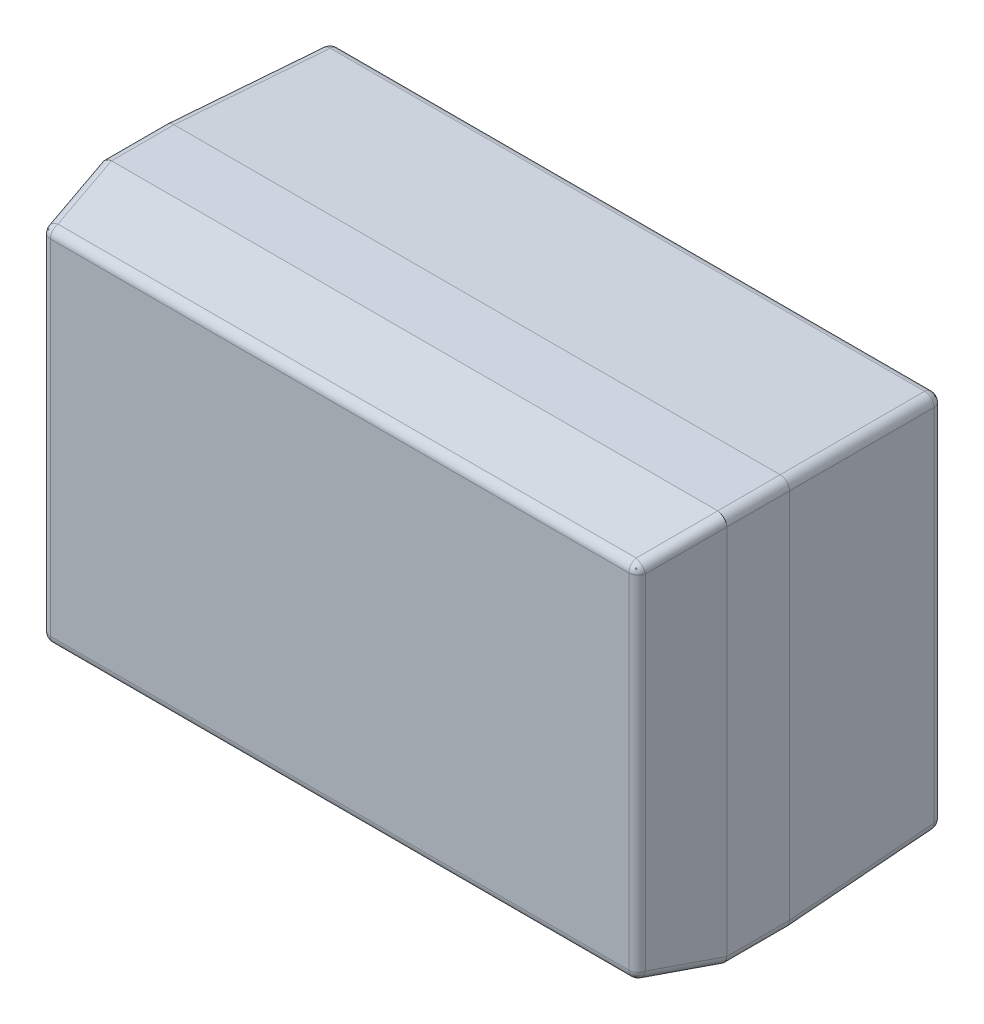
ISO-10303-21;
HEADER;
FILE_DESCRIPTION(('STEP AP214'),'2;1');
FILE_NAME('part.step','',(''),(''),'','','');
FILE_SCHEMA(('AUTOMOTIVE_DESIGN { 1 0 10303 214 1 1 1 1 }'));
ENDSEC;
DATA;
#1=APPLICATION_CONTEXT('core data for automotive mechanical design processes');
#2=APPLICATION_PROTOCOL_DEFINITION('international standard','automotive_design',2000,#1);
#3=PRODUCT_CONTEXT('',#1,'mechanical');
#4=PRODUCT('Part','Part','',(#3));
#5=PRODUCT_RELATED_PRODUCT_CATEGORY('part','',(#4));
#6=PRODUCT_DEFINITION_FORMATION('','',#4);
#7=PRODUCT_DEFINITION_CONTEXT('part definition',#1,'design');
#8=PRODUCT_DEFINITION('design','',#6,#7);
#9=PRODUCT_DEFINITION_SHAPE('','',#8);
#10=(LENGTH_UNIT() NAMED_UNIT(*) SI_UNIT(.MILLI.,.METRE.));
#11=(NAMED_UNIT(*) PLANE_ANGLE_UNIT() SI_UNIT($,.RADIAN.));
#12=(NAMED_UNIT(*) SI_UNIT($,.STERADIAN.) SOLID_ANGLE_UNIT());
#13=UNCERTAINTY_MEASURE_WITH_UNIT(LENGTH_MEASURE(1.E-05),#10,'distance_accuracy_value','');
#14=(GEOMETRIC_REPRESENTATION_CONTEXT(3) GLOBAL_UNCERTAINTY_ASSIGNED_CONTEXT((#13)) GLOBAL_UNIT_ASSIGNED_CONTEXT((#10,
#11,#12)) REPRESENTATION_CONTEXT('',''));
#15=CARTESIAN_POINT('',(0.,0.,0.));
#16=DIRECTION('',(0.,0.,1.));
#17=DIRECTION('',(1.,0.,0.));
#18=AXIS2_PLACEMENT_3D('',#15,#16,#17);
#19=CARTESIAN_POINT('',(-0.92560587332,-0.55060587332,0.92));
#20=DIRECTION('',(-0.495788828813145,-0.495788828812795,0.713012534566208));
#21=DIRECTION('',(-0.821023882220121,-2.57793786317961E-13,-0.570893847246755));
#22=AXIS2_PLACEMENT_3D('',#19,#20,#21);
#23=SPHERICAL_SURFACE('',#22,0.03);
#24=CARTESIAN_POINT('',(-0.940479538184394,-0.565479538184384,0.941390376036986));
#25=VERTEX_POINT('',#24);
#26=VERTEX_LOOP('',#25);
#27=FACE_BOUND('',#26,.T.);
#28=CARTESIAN_POINT('',(-0.925605873319475,-0.550605873319475,0.91999999999946));
#29=DIRECTION('',(0.199840191744013,0.199840191744013,0.959232920373062));
#30=DIRECTION('',(0.978980419737681,0.,-0.203954254111634));
#31=AXIS2_PLACEMENT_3D('',#28,#29,#30);
#32=CIRCLE('',#31,0.03);
#33=CARTESIAN_POINT('',(-0.92560587332,-0.579975285912041,0.926118627623009));
#34=VERTEX_POINT('',#33);
#35=CARTESIAN_POINT('',(-0.954975285911737,-0.55060587332,0.926118627622945));
#36=VERTEX_POINT('',#35);
#37=EDGE_CURVE('E132',#34,#36,#32,.F.);
#38=ORIENTED_EDGE('',*,*,#37,.F.);
#39=CARTESIAN_POINT('',(-0.92560587332,-0.55060587332,0.92));
#40=DIRECTION('',(-1.,0.,0.));
#41=DIRECTION('',(0.,-1.,0.));
#42=AXIS2_PLACEMENT_3D('',#39,#40,#41);
#43=CIRCLE('',#42,0.03);
#44=CARTESIAN_POINT('',(-0.92560587332,-0.55060587332,0.95));
#45=VERTEX_POINT('',#44);
#46=EDGE_CURVE('E134',#45,#34,#43,.F.);
#47=ORIENTED_EDGE('',*,*,#46,.F.);
#48=CARTESIAN_POINT('',(-0.92560587332,-0.55060587332,0.92));
#49=DIRECTION('',(0.,1.,0.));
#50=DIRECTION('',(-1.,0.,0.));
#51=AXIS2_PLACEMENT_3D('',#48,#49,#50);
#52=CIRCLE('',#51,0.03);
#53=EDGE_CURVE('E136',#36,#45,#52,.T.);
#54=ORIENTED_EDGE('',*,*,#53,.F.);
#55=EDGE_LOOP('',(#38,#47,#54));
#56=FACE_BOUND('',#55,.T.);
#57=ADVANCED_FACE('F17',(#27,#56),#23,.T.);
#58=CARTESIAN_POINT('',(0.92560587332,-0.55060587332,0.92));
#59=DIRECTION('',(0.495788828813145,-0.495788828812795,0.713012534566208));
#60=DIRECTION('',(-0.821023882220121,2.57793786317961E-13,0.570893847246755));
#61=AXIS2_PLACEMENT_3D('',#58,#59,#60);
#62=SPHERICAL_SURFACE('',#61,0.03);
#63=CARTESIAN_POINT('',(0.940479538184394,-0.565479538184384,0.941390376036986));
#64=VERTEX_POINT('',#63);
#65=VERTEX_LOOP('',#64);
#66=FACE_BOUND('',#65,.T.);
#67=CARTESIAN_POINT('',(0.92560587332,-0.55060587332,0.92));
#68=DIRECTION('',(-1.,0.,0.));
#69=DIRECTION('',(0.,-1.,0.));
#70=AXIS2_PLACEMENT_3D('',#67,#68,#69);
#71=CIRCLE('',#70,0.03);
#72=CARTESIAN_POINT('',(0.92560587332,-0.579975285911975,0.926118627622995));
#73=VERTEX_POINT('',#72);
#74=CARTESIAN_POINT('',(0.92560587332,-0.55060587332,0.95));
#75=VERTEX_POINT('',#74);
#76=EDGE_CURVE('E231',#73,#75,#71,.T.);
#77=ORIENTED_EDGE('',*,*,#76,.F.);
#78=CARTESIAN_POINT('',(0.925605873319808,-0.550605873319808,0.919999999999598));
#79=DIRECTION('',(0.199840191744013,-0.199840191744013,-0.959232920373062));
#80=DIRECTION('',(-0.978980419737681,0.,-0.203954254111634));
#81=AXIS2_PLACEMENT_3D('',#78,#79,#80);
#82=CIRCLE('',#81,0.03);
#83=CARTESIAN_POINT('',(0.954975285912041,-0.55060587332,0.926118627623009));
#84=VERTEX_POINT('',#83);
#85=EDGE_CURVE('E226',#84,#73,#82,.T.);
#86=ORIENTED_EDGE('',*,*,#85,.F.);
#87=CARTESIAN_POINT('',(0.92560587332,-0.55060587332,0.92));
#88=DIRECTION('',(0.,-1.,0.));
#89=DIRECTION('',(0.,0.,-1.));
#90=AXIS2_PLACEMENT_3D('',#87,#88,#89);
#91=CIRCLE('',#90,0.03);
#92=EDGE_CURVE('E141',#75,#84,#91,.F.);
#93=ORIENTED_EDGE('',*,*,#92,.F.);
#94=EDGE_LOOP('',(#77,#86,#93));
#95=FACE_BOUND('',#94,.T.);
#96=ADVANCED_FACE('F128',(#66,#95),#62,.T.);
#97=CARTESIAN_POINT('',(-0.92560587332,0.55060587332,0.92));
#98=DIRECTION('',(-0.495788828813145,0.495788828812795,0.713012534566208));
#99=DIRECTION('',(-0.821023882220121,2.57793786317961E-13,-0.570893847246755));
#100=AXIS2_PLACEMENT_3D('',#97,#98,#99);
#101=SPHERICAL_SURFACE('',#100,0.03);
#102=CARTESIAN_POINT('',(-0.940479538184394,0.565479538184384,0.941390376036986));
#103=VERTEX_POINT('',#102);
#104=VERTEX_LOOP('',#103);
#105=FACE_BOUND('',#104,.T.);
#106=CARTESIAN_POINT('',(-0.925605873319808,0.550605873319808,0.919999999999598));
#107=DIRECTION('',(0.199840191744013,-0.199840191744013,0.959232920373062));
#108=DIRECTION('',(0.978980419737681,0.,-0.203954254111634));
#109=AXIS2_PLACEMENT_3D('',#106,#107,#108);
#110=CIRCLE('',#109,0.03);
#111=CARTESIAN_POINT('',(-0.954975285912041,0.55060587332,0.926118627623009));
#112=VERTEX_POINT('',#111);
#113=CARTESIAN_POINT('',(-0.92560587332,0.579975285911975,0.926118627622995));
#114=VERTEX_POINT('',#113);
#115=EDGE_CURVE('E338',#112,#114,#110,.F.);
#116=ORIENTED_EDGE('',*,*,#115,.F.);
#117=CARTESIAN_POINT('',(-0.92560587332,0.55060587332,0.92));
#118=DIRECTION('',(0.,1.,0.));
#119=DIRECTION('',(-1.,0.,0.));
#120=AXIS2_PLACEMENT_3D('',#117,#118,#119);
#121=CIRCLE('',#120,0.03);
#122=CARTESIAN_POINT('',(-0.92560587332,0.55060587332,0.95));
#123=VERTEX_POINT('',#122);
#124=EDGE_CURVE('E21',#123,#112,#121,.F.);
#125=ORIENTED_EDGE('',*,*,#124,.F.);
#126=CARTESIAN_POINT('',(-0.92560587332,0.55060587332,0.92));
#127=DIRECTION('',(1.,0.,0.));
#128=DIRECTION('',(0.,0.,-1.));
#129=AXIS2_PLACEMENT_3D('',#126,#127,#128);
#130=CIRCLE('',#129,0.03);
#131=EDGE_CURVE('E333',#114,#123,#130,.T.);
#132=ORIENTED_EDGE('',*,*,#131,.F.);
#133=EDGE_LOOP('',(#116,#125,#132));
#134=FACE_BOUND('',#133,.T.);
#135=ADVANCED_FACE('F215',(#105,#134),#101,.T.);
#136=CARTESIAN_POINT('',(0.,0.,0.95));
#137=DIRECTION('',(0.,0.,1.));
#138=DIRECTION('',(1.,0.,0.));
#139=AXIS2_PLACEMENT_3D('',#136,#137,#138);
#140=PLANE('',#139);
#141=DIRECTION('',(0.,-1.,0.));
#142=VECTOR('',#141,1.);
#143=CARTESIAN_POINT('',(0.92560587332,-0.15625,0.95));
#144=LINE('',#143,#142);
#145=CARTESIAN_POINT('',(0.92560587332,0.55060587332,0.95));
#146=VERTEX_POINT('',#145);
#147=EDGE_CURVE('E224',#146,#75,#144,.T.);
#148=ORIENTED_EDGE('',*,*,#147,.F.);
#149=DIRECTION('',(1.,0.,0.));
#150=VECTOR('',#149,1.);
#151=CARTESIAN_POINT('',(0.25,0.55060587332,0.95));
#152=LINE('',#151,#150);
#153=EDGE_CURVE('E223',#123,#146,#152,.T.);
#154=ORIENTED_EDGE('',*,*,#153,.F.);
#155=DIRECTION('',(0.,1.,0.));
#156=VECTOR('',#155,1.);
#157=CARTESIAN_POINT('',(-0.92560587332,0.15625,0.95));
#158=LINE('',#157,#156);
#159=EDGE_CURVE('E110',#45,#123,#158,.T.);
#160=ORIENTED_EDGE('',*,*,#159,.F.);
#161=DIRECTION('',(-1.,0.,0.));
#162=VECTOR('',#161,1.);
#163=CARTESIAN_POINT('',(-0.25,-0.55060587332,0.95));
#164=LINE('',#163,#162);
#165=EDGE_CURVE('E142',#75,#45,#164,.T.);
#166=ORIENTED_EDGE('',*,*,#165,.F.);
#167=EDGE_LOOP('',(#148,#154,#160,#166));
#168=FACE_BOUND('',#167,.T.);
#169=ADVANCED_FACE('F211',(#168),#140,.T.);
#170=CARTESIAN_POINT('',(0.92560587332,0.55060587332,0.92));
#171=DIRECTION('',(0.495788828813145,0.495788828812795,0.713012534566208));
#172=DIRECTION('',(-0.821023882220121,-2.57793786317961E-13,0.570893847246755));
#173=AXIS2_PLACEMENT_3D('',#170,#171,#172);
#174=SPHERICAL_SURFACE('',#173,0.03);
#175=CARTESIAN_POINT('',(0.940479538184394,0.565479538184384,0.941390376036986));
#176=VERTEX_POINT('',#175);
#177=VERTEX_LOOP('',#176);
#178=FACE_BOUND('',#177,.T.);
#179=CARTESIAN_POINT('',(0.925605873319475,0.550605873319475,0.91999999999946));
#180=DIRECTION('',(-0.199840191744013,-0.199840191744013,0.959232920373062));
#181=DIRECTION('',(0.978980419737681,0.,0.203954254111634));
#182=AXIS2_PLACEMENT_3D('',#179,#180,#181);
#183=CIRCLE('',#182,0.03);
#184=CARTESIAN_POINT('',(0.92560587332,0.579975285912041,0.926118627623009));
#185=VERTEX_POINT('',#184);
#186=CARTESIAN_POINT('',(0.954975285911747,0.550605873319738,0.926118627622893));
#187=VERTEX_POINT('',#186);
#188=EDGE_CURVE('E180',#185,#187,#183,.F.);
#189=ORIENTED_EDGE('',*,*,#188,.F.);
#190=CARTESIAN_POINT('',(0.92560587332,0.55060587332,0.92));
#191=DIRECTION('',(1.,0.,0.));
#192=DIRECTION('',(0.,0.,-1.));
#193=AXIS2_PLACEMENT_3D('',#190,#191,#192);
#194=CIRCLE('',#193,0.03);
#195=EDGE_CURVE('E336',#146,#185,#194,.F.);
#196=ORIENTED_EDGE('',*,*,#195,.F.);
#197=CARTESIAN_POINT('',(0.92560587332,0.55060587332,0.92));
#198=DIRECTION('',(0.,-1.,0.));
#199=DIRECTION('',(0.,0.,-1.));
#200=AXIS2_PLACEMENT_3D('',#197,#198,#199);
#201=CIRCLE('',#200,0.03);
#202=EDGE_CURVE('E227',#187,#146,#201,.T.);
#203=ORIENTED_EDGE('',*,*,#202,.F.);
#204=EDGE_LOOP('',(#189,#196,#203));
#205=FACE_BOUND('',#204,.T.);
#206=ADVANCED_FACE('F206',(#178,#205),#174,.T.);
#207=CARTESIAN_POINT('',(-0.92560587332,0.15625,0.92));
#208=DIRECTION('',(0.,1.,0.));
#209=DIRECTION('',(-1.,0.,0.));
#210=AXIS2_PLACEMENT_3D('',#207,#208,#209);
#211=CYLINDRICAL_SURFACE('',#210,0.03);
#212=ORIENTED_EDGE('',*,*,#53,.T.);
#213=ORIENTED_EDGE('',*,*,#159,.T.);
#214=ORIENTED_EDGE('',*,*,#124,.T.);
#215=DIRECTION('',(0.,1.,0.));
#216=VECTOR('',#215,1.);
#217=CARTESIAN_POINT('',(-0.954975285911888,0.3125,0.926118627622977));
#218=LINE('',#217,#216);
#219=EDGE_CURVE('E175',#36,#112,#218,.T.);
#220=ORIENTED_EDGE('',*,*,#219,.F.);
#221=EDGE_LOOP('',(#212,#213,#214,#220));
#222=FACE_BOUND('',#221,.T.);
#223=ADVANCED_FACE('F210',(#222),#211,.T.);
#224=CARTESIAN_POINT('',(-0.25,-0.55060587332,0.92));
#225=DIRECTION('',(-1.,0.,0.));
#226=DIRECTION('',(0.,-1.,0.));
#227=AXIS2_PLACEMENT_3D('',#224,#225,#226);
#228=CYLINDRICAL_SURFACE('',#227,0.03);
#229=ORIENTED_EDGE('',*,*,#76,.T.);
#230=ORIENTED_EDGE('',*,*,#165,.T.);
#231=ORIENTED_EDGE('',*,*,#46,.T.);
#232=DIRECTION('',(1.,0.,0.));
#233=VECTOR('',#232,1.);
#234=CARTESIAN_POINT('',(-0.5,-0.579975285911888,0.926118627622977));
#235=LINE('',#234,#233);
#236=EDGE_CURVE('E156',#73,#34,#235,.F.);
#237=ORIENTED_EDGE('',*,*,#236,.F.);
#238=EDGE_LOOP('',(#229,#230,#231,#237));
#239=FACE_BOUND('',#238,.T.);
#240=ADVANCED_FACE('F546',(#239),#228,.T.);
#241=CARTESIAN_POINT('',(-0.919097816345,-0.544097816345,0.951238673477));
#242=DIRECTION('',(0.199840191744013,0.199840191744013,0.959232920373062));
#243=DIRECTION('',(0.978980419737681,0.,-0.203954254111634));
#244=AXIS2_PLACEMENT_3D('',#241,#242,#243);
#245=CYLINDRICAL_SURFACE('',#244,0.03);
#246=DIRECTION('',(0.199840191744258,0.199840191744869,0.959232920372832));
#247=VECTOR('',#246,1.);
#248=CARTESIAN_POINT('',(-0.99999350771875,-0.595624095127,0.710031162949948));
#249=LINE('',#248,#247);
#250=CARTESIAN_POINT('',(-0.999996753859308,-0.595312047563499,0.71001558147497));
#251=VERTEX_POINT('',#250);
#252=EDGE_CURVE('E178',#251,#36,#249,.T.);
#253=ORIENTED_EDGE('',*,*,#252,.F.);
#254=CARTESIAN_POINT('',(-0.97,-0.595,0.706908191932541));
#255=DIRECTION('',(0.100954296128172,0.100954296128172,0.989755757844596));
#256=DIRECTION('',(-0.699863008090344,-0.699863008090344,0.14277093476429));
#257=AXIS2_PLACEMENT_3D('',#254,#255,#256);
#258=ELLIPSE('',#257,0.0303105081857077,0.03);
#259=CARTESIAN_POINT('',(-0.970312047563499,-0.624996753859308,0.71001558147497));
#260=VERTEX_POINT('',#259);
#261=EDGE_CURVE('E150',#260,#251,#258,.F.);
#262=ORIENTED_EDGE('',*,*,#261,.F.);
#263=DIRECTION('',(-0.199840191744869,-0.199840191744258,-0.959232920372832));
#264=VECTOR('',#263,1.);
#265=CARTESIAN_POINT('',(-0.92560587332,-0.579975285911888,0.926118627622977));
#266=LINE('',#265,#264);
#267=EDGE_CURVE('E146',#34,#260,#266,.T.);
#268=ORIENTED_EDGE('',*,*,#267,.F.);
#269=ORIENTED_EDGE('',*,*,#37,.T.);
#270=EDGE_LOOP('',(#253,#262,#268,#269));
#271=FACE_BOUND('',#270,.T.);
#272=ADVANCED_FACE('F147',(#271),#245,.T.);
#273=CARTESIAN_POINT('',(0.92560587332,-0.15625,0.92));
#274=DIRECTION('',(0.,-1.,0.));
#275=DIRECTION('',(0.,0.,-1.));
#276=AXIS2_PLACEMENT_3D('',#273,#274,#275);
#277=CYLINDRICAL_SURFACE('',#276,0.03);
#278=ORIENTED_EDGE('',*,*,#202,.T.);
#279=ORIENTED_EDGE('',*,*,#147,.T.);
#280=ORIENTED_EDGE('',*,*,#92,.T.);
#281=DIRECTION('',(0.,1.,0.));
#282=VECTOR('',#281,1.);
#283=CARTESIAN_POINT('',(0.954975285911888,-0.3125,0.926118627622977));
#284=LINE('',#283,#282);
#285=EDGE_CURVE('E195',#187,#84,#284,.F.);
#286=ORIENTED_EDGE('',*,*,#285,.F.);
#287=EDGE_LOOP('',(#278,#279,#280,#286));
#288=FACE_BOUND('',#287,.T.);
#289=ADVANCED_FACE('F540',(#288),#277,.T.);
#290=CARTESIAN_POINT('',(0.911609797176,-0.536609797176,0.98718116549));
#291=DIRECTION('',(0.199840191744013,-0.199840191744013,-0.959232920373062));
#292=DIRECTION('',(-0.978980419737681,0.,-0.203954254111634));
#293=AXIS2_PLACEMENT_3D('',#290,#291,#292);
#294=CYLINDRICAL_SURFACE('',#293,0.03);
#295=DIRECTION('',(-0.199840191744869,0.199840191744258,0.959232920372832));
#296=VECTOR('',#295,1.);
#297=CARTESIAN_POINT('',(0.970624095127,-0.62499350771875,0.710031162949948));
#298=LINE('',#297,#296);
#299=CARTESIAN_POINT('',(0.970312047563499,-0.624996753859365,0.710015581474982));
#300=VERTEX_POINT('',#299);
#301=EDGE_CURVE('E160',#300,#73,#298,.T.);
#302=ORIENTED_EDGE('',*,*,#301,.F.);
#303=CARTESIAN_POINT('',(0.97,-0.595,0.706908191934274));
#304=DIRECTION('',(-0.100954296128172,0.100954296128172,0.989755757844596));
#305=DIRECTION('',(0.699863008090344,-0.699863008090344,0.14277093476429));
#306=AXIS2_PLACEMENT_3D('',#303,#304,#305);
#307=ELLIPSE('',#306,0.0303105081857077,0.03);
#308=CARTESIAN_POINT('',(0.999996753859365,-0.595312047563499,0.710015581474982));
#309=VERTEX_POINT('',#308);
#310=EDGE_CURVE('E319',#309,#300,#307,.F.);
#311=ORIENTED_EDGE('',*,*,#310,.F.);
#312=DIRECTION('',(0.199840191744258,-0.199840191744869,-0.959232920372832));
#313=VECTOR('',#312,1.);
#314=CARTESIAN_POINT('',(0.954975285911888,-0.55060587332,0.926118627622977));
#315=LINE('',#314,#313);
#316=EDGE_CURVE('E197',#84,#309,#315,.T.);
#317=ORIENTED_EDGE('',*,*,#316,.F.);
#318=ORIENTED_EDGE('',*,*,#85,.T.);
#319=EDGE_LOOP('',(#302,#311,#317,#318));
#320=FACE_BOUND('',#319,.T.);
#321=ADVANCED_FACE('F537',(#320),#294,.T.);
#322=CARTESIAN_POINT('',(-0.911609797176,0.536609797176,0.98718116549));
#323=DIRECTION('',(0.199840191744013,-0.199840191744013,0.959232920373062));
#324=DIRECTION('',(0.978980419737681,0.,-0.203954254111634));
#325=AXIS2_PLACEMENT_3D('',#322,#323,#324);
#326=CYLINDRICAL_SURFACE('',#325,0.03);
#327=DIRECTION('',(0.199840191744869,-0.199840191744258,0.959232920372832));
#328=VECTOR('',#327,1.);
#329=CARTESIAN_POINT('',(-0.970624095127,0.624993507718751,0.710031162949948));
#330=LINE('',#329,#328);
#331=CARTESIAN_POINT('',(-0.970312047563499,0.624996753859365,0.710015581474982));
#332=VERTEX_POINT('',#331);
#333=EDGE_CURVE('E194',#332,#114,#330,.T.);
#334=ORIENTED_EDGE('',*,*,#333,.F.);
#335=CARTESIAN_POINT('',(-0.97,0.595,0.706908191934274));
#336=DIRECTION('',(0.100954296128172,-0.100954296128172,0.989755757844596));
#337=DIRECTION('',(-0.699863008090344,0.699863008090344,0.14277093476429));
#338=AXIS2_PLACEMENT_3D('',#335,#336,#337);
#339=ELLIPSE('',#338,0.0303105081857077,0.03);
#340=CARTESIAN_POINT('',(-0.999996753859365,0.595312047563499,0.710015581474982));
#341=VERTEX_POINT('',#340);
#342=EDGE_CURVE('E316',#341,#332,#339,.F.);
#343=ORIENTED_EDGE('',*,*,#342,.F.);
#344=DIRECTION('',(-0.199840191744258,0.199840191744869,-0.959232920372832));
#345=VECTOR('',#344,1.);
#346=CARTESIAN_POINT('',(-0.954975285911888,0.55060587332,0.926118627622977));
#347=LINE('',#346,#345);
#348=EDGE_CURVE('E170',#112,#341,#347,.T.);
#349=ORIENTED_EDGE('',*,*,#348,.F.);
#350=ORIENTED_EDGE('',*,*,#115,.T.);
#351=EDGE_LOOP('',(#334,#343,#349,#350));
#352=FACE_BOUND('',#351,.T.);
#353=ADVANCED_FACE('F357',(#352),#326,.T.);
#354=CARTESIAN_POINT('',(0.25,0.55060587332,0.92));
#355=DIRECTION('',(1.,0.,0.));
#356=DIRECTION('',(0.,0.,-1.));
#357=AXIS2_PLACEMENT_3D('',#354,#355,#356);
#358=CYLINDRICAL_SURFACE('',#357,0.03);
#359=ORIENTED_EDGE('',*,*,#131,.T.);
#360=ORIENTED_EDGE('',*,*,#153,.T.);
#361=ORIENTED_EDGE('',*,*,#195,.T.);
#362=DIRECTION('',(1.,0.,0.));
#363=VECTOR('',#362,1.);
#364=CARTESIAN_POINT('',(0.5,0.579975285911888,0.926118627622977));
#365=LINE('',#364,#363);
#366=EDGE_CURVE('E190',#114,#185,#365,.T.);
#367=ORIENTED_EDGE('',*,*,#366,.F.);
#368=EDGE_LOOP('',(#359,#360,#361,#367));
#369=FACE_BOUND('',#368,.T.);
#370=ADVANCED_FACE('F530',(#369),#358,.T.);
#371=CARTESIAN_POINT('',(0.919097816345,0.544097816345,0.951238673477));
#372=DIRECTION('',(-0.199840191744013,-0.199840191744013,0.959232920373062));
#373=DIRECTION('',(0.978980419737681,0.,0.203954254111634));
#374=AXIS2_PLACEMENT_3D('',#371,#372,#373);
#375=CYLINDRICAL_SURFACE('',#374,0.03);
#376=DIRECTION('',(0.199840191744258,0.199840191744869,-0.959232920372832));
#377=VECTOR('',#376,1.);
#378=CARTESIAN_POINT('',(0.954975285911888,0.55060587332,0.926118627622977));
#379=LINE('',#378,#377);
#380=CARTESIAN_POINT('',(0.999996753859286,0.59531204756332,0.710015581474926));
#381=VERTEX_POINT('',#380);
#382=EDGE_CURVE('E158',#381,#187,#379,.F.);
#383=ORIENTED_EDGE('',*,*,#382,.F.);
#384=CARTESIAN_POINT('',(0.97,0.595,0.706908191932541));
#385=DIRECTION('',(-0.100954296128172,-0.100954296128172,0.989755757844596));
#386=DIRECTION('',(0.699863008090344,0.699863008090344,0.14277093476429));
#387=AXIS2_PLACEMENT_3D('',#384,#385,#386);
#388=ELLIPSE('',#387,0.0303105081857077,0.03);
#389=CARTESIAN_POINT('',(0.970312047563499,0.624996753859308,0.71001558147497));
#390=VERTEX_POINT('',#389);
#391=EDGE_CURVE('E310',#390,#381,#388,.F.);
#392=ORIENTED_EDGE('',*,*,#391,.F.);
#393=DIRECTION('',(0.199840191744869,0.199840191744258,-0.959232920372832));
#394=VECTOR('',#393,1.);
#395=CARTESIAN_POINT('',(0.92560587332,0.579975285911888,0.926118627622977));
#396=LINE('',#395,#394);
#397=EDGE_CURVE('E193',#185,#390,#396,.T.);
#398=ORIENTED_EDGE('',*,*,#397,.F.);
#399=ORIENTED_EDGE('',*,*,#188,.T.);
#400=EDGE_LOOP('',(#383,#392,#398,#399));
#401=FACE_BOUND('',#400,.T.);
#402=ADVANCED_FACE('F527',(#401),#375,.T.);
#403=CARTESIAN_POINT('',(-0.975,0.3125,0.83));
#404=DIRECTION('',(-0.978980419737622,0.,0.203954254111921));
#405=DIRECTION('',(0.203954254111921,0.,0.978980419737622));
#406=AXIS2_PLACEMENT_3D('',#403,#404,#405);
#407=PLANE('',#406);
#408=ORIENTED_EDGE('',*,*,#219,.T.);
#409=ORIENTED_EDGE('',*,*,#348,.T.);
#410=DIRECTION('',(0.,-1.,0.));
#411=VECTOR('',#410,1.);
#412=CARTESIAN_POINT('',(-1.,0.625,0.71));
#413=LINE('',#412,#411);
#414=EDGE_CURVE('E183',#251,#341,#413,.F.);
#415=ORIENTED_EDGE('',*,*,#414,.F.);
#416=ORIENTED_EDGE('',*,*,#252,.T.);
#417=EDGE_LOOP('',(#408,#409,#415,#416));
#418=FACE_BOUND('',#417,.T.);
#419=ADVANCED_FACE('F349',(#418),#407,.T.);
#420=CARTESIAN_POINT('',(-0.5,-0.6,0.83));
#421=DIRECTION('',(0.,-0.978980419737622,0.203954254111921));
#422=DIRECTION('',(0.,-0.203954254111921,-0.978980419737622));
#423=AXIS2_PLACEMENT_3D('',#420,#421,#422);
#424=PLANE('',#423);
#425=ORIENTED_EDGE('',*,*,#267,.T.);
#426=DIRECTION('',(1.,0.,0.));
#427=VECTOR('',#426,1.);
#428=CARTESIAN_POINT('',(-1.,-0.625,0.71));
#429=LINE('',#428,#427);
#430=EDGE_CURVE('E401',#300,#260,#429,.F.);
#431=ORIENTED_EDGE('',*,*,#430,.F.);
#432=ORIENTED_EDGE('',*,*,#301,.T.);
#433=ORIENTED_EDGE('',*,*,#236,.T.);
#434=EDGE_LOOP('',(#425,#431,#432,#433));
#435=FACE_BOUND('',#434,.T.);
#436=ADVANCED_FACE('F521',(#435),#424,.T.);
#437=CARTESIAN_POINT('',(-0.97,-0.595,0.));
#438=DIRECTION('',(0.,0.,1.));
#439=DIRECTION('',(1.,0.,0.));
#440=AXIS2_PLACEMENT_3D('',#437,#438,#439);
#441=CYLINDRICAL_SURFACE('',#440,0.03);
#442=DIRECTION('',(0.,0.,1.));
#443=VECTOR('',#442,1.);
#444=CARTESIAN_POINT('',(-1.,-0.595,0.));
#445=LINE('',#444,#443);
#446=CARTESIAN_POINT('',(-0.999999997789216,-0.595011520100413,0.509999971834094));
#447=VERTEX_POINT('',#446);
#448=EDGE_CURVE('E187',#447,#251,#445,.T.);
#449=ORIENTED_EDGE('',*,*,#448,.F.);
#450=CARTESIAN_POINT('',(-0.97,-0.595,0.510588009299466));
#451=DIRECTION('',(0.0195852722215471,0.0195852722215471,-0.999616343515859));
#452=DIRECTION('',(0.706835495084965,0.706835495084965,0.0276977575984799));
#453=AXIS2_PLACEMENT_3D('',#450,#451,#452);
#454=ELLIPSE('',#453,0.030011514111988,0.03);
#455=CARTESIAN_POINT('',(-0.970011516701246,-0.624999995579062,0.509999924841321));
#456=VERTEX_POINT('',#455);
#457=EDGE_CURVE('E303',#456,#447,#454,.T.);
#458=ORIENTED_EDGE('',*,*,#457,.F.);
#459=DIRECTION('',(0.,0.,1.));
#460=VECTOR('',#459,1.);
#461=CARTESIAN_POINT('',(-0.97,-0.625,0.));
#462=LINE('',#461,#460);
#463=EDGE_CURVE('E307',#260,#456,#462,.F.);
#464=ORIENTED_EDGE('',*,*,#463,.F.);
#465=ORIENTED_EDGE('',*,*,#261,.T.);
#466=EDGE_LOOP('',(#449,#458,#464,#465));
#467=FACE_BOUND('',#466,.T.);
#468=ADVANCED_FACE('F517',(#467),#441,.T.);
#469=CARTESIAN_POINT('',(0.975,-0.3125,0.83));
#470=DIRECTION('',(0.978980419737622,0.,0.203954254111921));
#471=DIRECTION('',(0.203954254111921,0.,-0.978980419737622));
#472=AXIS2_PLACEMENT_3D('',#469,#470,#471);
#473=PLANE('',#472);
#474=ORIENTED_EDGE('',*,*,#316,.T.);
#475=DIRECTION('',(0.,1.,0.));
#476=VECTOR('',#475,1.);
#477=CARTESIAN_POINT('',(1.,-0.625,0.71));
#478=LINE('',#477,#476);
#479=EDGE_CURVE('E393',#381,#309,#478,.F.);
#480=ORIENTED_EDGE('',*,*,#479,.F.);
#481=ORIENTED_EDGE('',*,*,#382,.T.);
#482=ORIENTED_EDGE('',*,*,#285,.T.);
#483=EDGE_LOOP('',(#474,#480,#481,#482));
#484=FACE_BOUND('',#483,.T.);
#485=ADVANCED_FACE('F513',(#484),#473,.T.);
#486=CARTESIAN_POINT('',(0.97,-0.595,0.));
#487=DIRECTION('',(0.,0.,1.));
#488=DIRECTION('',(1.,0.,0.));
#489=AXIS2_PLACEMENT_3D('',#486,#487,#488);
#490=CYLINDRICAL_SURFACE('',#489,0.03);
#491=DIRECTION('',(0.,0.,1.));
#492=VECTOR('',#491,1.);
#493=CARTESIAN_POINT('',(0.97,-0.625,0.));
#494=LINE('',#493,#492);
#495=CARTESIAN_POINT('',(0.970011519648841,-0.624999997051857,0.509999962440937));
#496=VERTEX_POINT('',#495);
#497=EDGE_CURVE('E186',#496,#300,#494,.T.);
#498=ORIENTED_EDGE('',*,*,#497,.F.);
#499=CARTESIAN_POINT('',(0.97,-0.595,0.510588009318967));
#500=DIRECTION('',(-0.0195852722215471,0.0195852722215471,-0.999616343515859));
#501=DIRECTION('',(-0.706835495084965,0.706835495084965,0.0276977575984799));
#502=AXIS2_PLACEMENT_3D('',#499,#500,#501);
#503=ELLIPSE('',#502,0.030011514111988,0.03);
#504=CARTESIAN_POINT('',(0.999999995578935,-0.595011516701246,0.509999924841326));
#505=VERTEX_POINT('',#504);
#506=EDGE_CURVE('E295',#505,#496,#503,.T.);
#507=ORIENTED_EDGE('',*,*,#506,.F.);
#508=DIRECTION('',(0.,0.,-1.));
#509=VECTOR('',#508,1.);
#510=CARTESIAN_POINT('',(1.,-0.595,0.));
#511=LINE('',#510,#509);
#512=EDGE_CURVE('E300',#309,#505,#511,.T.);
#513=ORIENTED_EDGE('',*,*,#512,.F.);
#514=ORIENTED_EDGE('',*,*,#310,.T.);
#515=EDGE_LOOP('',(#498,#507,#513,#514));
#516=FACE_BOUND('',#515,.T.);
#517=ADVANCED_FACE('F510',(#516),#490,.T.);
#518=CARTESIAN_POINT('',(-0.97,0.595,0.));
#519=DIRECTION('',(0.,0.,1.));
#520=DIRECTION('',(1.,0.,0.));
#521=AXIS2_PLACEMENT_3D('',#518,#519,#520);
#522=CYLINDRICAL_SURFACE('',#521,0.03);
#523=DIRECTION('',(0.,0.,1.));
#524=VECTOR('',#523,1.);
#525=CARTESIAN_POINT('',(-0.97,0.625,0.));
#526=LINE('',#525,#524);
#527=CARTESIAN_POINT('',(-0.970011519648841,0.624999997051857,0.509999962440937));
#528=VERTEX_POINT('',#527);
#529=EDGE_CURVE('E390',#528,#332,#526,.T.);
#530=ORIENTED_EDGE('',*,*,#529,.F.);
#531=CARTESIAN_POINT('',(-0.97,0.595,0.510588009318967));
#532=DIRECTION('',(0.0195852722215471,-0.0195852722215471,-0.999616343515859));
#533=DIRECTION('',(0.706835495084965,-0.706835495084965,0.0276977575984799));
#534=AXIS2_PLACEMENT_3D('',#531,#532,#533);
#535=ELLIPSE('',#534,0.030011514111988,0.03);
#536=CARTESIAN_POINT('',(-0.999999995578876,0.595011516783484,0.509999915447582));
#537=VERTEX_POINT('',#536);
#538=EDGE_CURVE('E291',#537,#528,#535,.T.);
#539=ORIENTED_EDGE('',*,*,#538,.F.);
#540=DIRECTION('',(0.,0.,1.));
#541=VECTOR('',#540,1.);
#542=CARTESIAN_POINT('',(-1.,0.595,0.));
#543=LINE('',#542,#541);
#544=EDGE_CURVE('E313',#341,#537,#543,.F.);
#545=ORIENTED_EDGE('',*,*,#544,.F.);
#546=ORIENTED_EDGE('',*,*,#342,.T.);
#547=EDGE_LOOP('',(#530,#539,#545,#546));
#548=FACE_BOUND('',#547,.T.);
#549=ADVANCED_FACE('F372',(#548),#522,.T.);
#550=CARTESIAN_POINT('',(0.5,0.6,0.83));
#551=DIRECTION('',(0.,0.978980419737622,0.203954254111921));
#552=DIRECTION('',(0.,-0.203954254111921,0.978980419737622));
#553=AXIS2_PLACEMENT_3D('',#550,#551,#552);
#554=PLANE('',#553);
#555=ORIENTED_EDGE('',*,*,#366,.T.);
#556=ORIENTED_EDGE('',*,*,#397,.T.);
#557=DIRECTION('',(1.,0.,0.));
#558=VECTOR('',#557,1.);
#559=CARTESIAN_POINT('',(1.,0.625,0.71));
#560=LINE('',#559,#558);
#561=EDGE_CURVE('E288',#332,#390,#560,.T.);
#562=ORIENTED_EDGE('',*,*,#561,.F.);
#563=ORIENTED_EDGE('',*,*,#333,.T.);
#564=EDGE_LOOP('',(#555,#556,#562,#563));
#565=FACE_BOUND('',#564,.T.);
#566=ADVANCED_FACE('F503',(#565),#554,.T.);
#567=CARTESIAN_POINT('',(0.97,0.595,0.));
#568=DIRECTION('',(0.,0.,1.));
#569=DIRECTION('',(1.,0.,0.));
#570=AXIS2_PLACEMENT_3D('',#567,#568,#569);
#571=CYLINDRICAL_SURFACE('',#570,0.03);
#572=DIRECTION('',(0.,0.,-1.));
#573=VECTOR('',#572,1.);
#574=CARTESIAN_POINT('',(1.,0.595,0.));
#575=LINE('',#574,#573);
#576=CARTESIAN_POINT('',(0.999999997789216,0.595011520100413,0.509999971834094));
#577=VERTEX_POINT('',#576);
#578=EDGE_CURVE('E306',#577,#381,#575,.F.);
#579=ORIENTED_EDGE('',*,*,#578,.F.);
#580=CARTESIAN_POINT('',(0.97,0.595,0.510588009299466));
#581=DIRECTION('',(0.0195852722215471,0.0195852722215471,0.999616343515859));
#582=DIRECTION('',(0.706835495084965,0.706835495084965,-0.0276977575984799));
#583=AXIS2_PLACEMENT_3D('',#580,#581,#582);
#584=ELLIPSE('',#583,0.030011514111988,0.03);
#585=CARTESIAN_POINT('',(0.970011516701246,0.624999995579062,0.509999924841321));
#586=VERTEX_POINT('',#585);
#587=EDGE_CURVE('E283',#586,#577,#584,.F.);
#588=ORIENTED_EDGE('',*,*,#587,.F.);
#589=DIRECTION('',(0.,0.,1.));
#590=VECTOR('',#589,1.);
#591=CARTESIAN_POINT('',(0.97,0.625,0.));
#592=LINE('',#591,#590);
#593=EDGE_CURVE('E294',#390,#586,#592,.F.);
#594=ORIENTED_EDGE('',*,*,#593,.F.);
#595=ORIENTED_EDGE('',*,*,#391,.T.);
#596=EDGE_LOOP('',(#579,#588,#594,#595));
#597=FACE_BOUND('',#596,.T.);
#598=ADVANCED_FACE('F500',(#597),#571,.T.);
#599=CARTESIAN_POINT('',(-1.,0.625,0.));
#600=DIRECTION('',(-1.,0.,0.));
#601=DIRECTION('',(0.,-1.,0.));
#602=AXIS2_PLACEMENT_3D('',#599,#600,#601);
#603=PLANE('',#602);
#604=ORIENTED_EDGE('',*,*,#448,.T.);
#605=ORIENTED_EDGE('',*,*,#414,.T.);
#606=ORIENTED_EDGE('',*,*,#544,.T.);
#607=DIRECTION('',(0.,1.,0.));
#608=VECTOR('',#607,1.);
#609=CARTESIAN_POINT('',(-0.999999999999994,0.3125,0.51));
#610=LINE('',#609,#608);
#611=EDGE_CURVE('E278',#447,#537,#610,.T.);
#612=ORIENTED_EDGE('',*,*,#611,.F.);
#613=EDGE_LOOP('',(#604,#605,#606,#612));
#614=FACE_BOUND('',#613,.T.);
#615=ADVANCED_FACE('F367',(#614),#603,.T.);
#616=CARTESIAN_POINT('',(-1.,-0.625,0.));
#617=DIRECTION('',(0.,-1.,0.));
#618=DIRECTION('',(1.,0.,0.));
#619=AXIS2_PLACEMENT_3D('',#616,#617,#618);
#620=PLANE('',#619);
#621=ORIENTED_EDGE('',*,*,#463,.T.);
#622=DIRECTION('',(1.,0.,0.));
#623=VECTOR('',#622,1.);
#624=CARTESIAN_POINT('',(-0.5,-0.624999999999994,0.51));
#625=LINE('',#624,#623);
#626=EDGE_CURVE('E441',#496,#456,#625,.F.);
#627=ORIENTED_EDGE('',*,*,#626,.F.);
#628=ORIENTED_EDGE('',*,*,#497,.T.);
#629=ORIENTED_EDGE('',*,*,#430,.T.);
#630=EDGE_LOOP('',(#621,#627,#628,#629));
#631=FACE_BOUND('',#630,.T.);
#632=ADVANCED_FACE('F494',(#631),#620,.T.);
#633=CARTESIAN_POINT('',(-0.958982377559,-0.583982377559,0.229638637054));
#634=DIRECTION('',(0.0391555164097312,0.0391555164097312,-0.998465668448032));
#635=DIRECTION('',(-0.999231950731542,0.,-0.0391855666953591));
#636=AXIS2_PLACEMENT_3D('',#633,#634,#635);
#637=CYLINDRICAL_SURFACE('',#636,0.03);
#638=DIRECTION('',(0.0391555164081966,0.0391555164097064,-0.998465668448093));
#639=VECTOR('',#638,1.);
#640=CARTESIAN_POINT('',(-0.970023032636,-0.624999991158268,0.50999977453599));
#641=LINE('',#640,#639);
#642=CARTESIAN_POINT('',(-0.9511534114,-0.606130369921748,0.028824432999147));
#643=VERTEX_POINT('',#642);
#644=EDGE_CURVE('E274',#456,#643,#641,.T.);
#645=ORIENTED_EDGE('',*,*,#644,.F.);
#646=ORIENTED_EDGE('',*,*,#457,.T.);
#647=DIRECTION('',(0.0391555164097057,0.0391555164087644,-0.99846566844807));
#648=VECTOR('',#647,1.);
#649=CARTESIAN_POINT('',(-0.999999999999994,-0.595023041478001,0.51));
#650=LINE('',#649,#648);
#651=CARTESIAN_POINT('',(-0.981130369921753,-0.57615341140001,0.0288244329991493));
#652=VERTEX_POINT('',#651);
#653=EDGE_CURVE('E275',#652,#447,#650,.F.);
#654=ORIENTED_EDGE('',*,*,#653,.F.);
#655=CARTESIAN_POINT('',(-0.951153411400019,-0.576153411400019,0.0300000000000014));
#656=DIRECTION('',(0.0391555164097312,0.0391555164097312,-0.998465668448032));
#657=DIRECTION('',(-0.999231950731542,0.,-0.0391855666953591));
#658=AXIS2_PLACEMENT_3D('',#655,#656,#657);
#659=CIRCLE('',#658,0.03);
#660=EDGE_CURVE('E270',#643,#652,#659,.T.);
#661=ORIENTED_EDGE('',*,*,#660,.F.);
#662=EDGE_LOOP('',(#645,#646,#654,#661));
#663=FACE_BOUND('',#662,.T.);
#664=ADVANCED_FACE('F490',(#663),#637,.T.);
#665=CARTESIAN_POINT('',(1.,-0.625,0.));
#666=DIRECTION('',(1.,0.,0.));
#667=DIRECTION('',(0.,0.,-1.));
#668=AXIS2_PLACEMENT_3D('',#665,#666,#667);
#669=PLANE('',#668);
#670=ORIENTED_EDGE('',*,*,#512,.T.);
#671=DIRECTION('',(0.,1.,0.));
#672=VECTOR('',#671,1.);
#673=CARTESIAN_POINT('',(0.999999999999994,-0.3125,0.51));
#674=LINE('',#673,#672);
#675=EDGE_CURVE('E269',#577,#505,#674,.F.);
#676=ORIENTED_EDGE('',*,*,#675,.F.);
#677=ORIENTED_EDGE('',*,*,#578,.T.);
#678=ORIENTED_EDGE('',*,*,#479,.T.);
#679=EDGE_LOOP('',(#670,#676,#677,#678));
#680=FACE_BOUND('',#679,.T.);
#681=ADVANCED_FACE('F486',(#680),#669,.T.);
#682=CARTESIAN_POINT('',(0.958694911096,-0.583694911096,0.222308242267));
#683=DIRECTION('',(-0.0391555164097312,0.0391555164097312,-0.998465668448032));
#684=DIRECTION('',(-0.999231950731542,0.,0.0391855666953591));
#685=AXIS2_PLACEMENT_3D('',#682,#683,#684);
#686=CYLINDRICAL_SURFACE('',#685,0.03);
#687=DIRECTION('',(-0.0391555164097069,0.0391555164081966,-0.998465668448093));
#688=VECTOR('',#687,1.);
#689=CARTESIAN_POINT('',(0.999999991158268,-0.595023032636,0.50999977453599));
#690=LINE('',#689,#688);
#691=CARTESIAN_POINT('',(0.981130369921744,-0.5761534114,0.0288244329991501));
#692=VERTEX_POINT('',#691);
#693=EDGE_CURVE('E265',#505,#692,#690,.T.);
#694=ORIENTED_EDGE('',*,*,#693,.F.);
#695=ORIENTED_EDGE('',*,*,#506,.T.);
#696=DIRECTION('',(0.0391555164087653,-0.0391555164097057,0.99846566844807));
#697=VECTOR('',#696,1.);
#698=CARTESIAN_POINT('',(0.951153411400001,-0.606130369921541,0.028824432999158));
#699=LINE('',#698,#697);
#700=CARTESIAN_POINT('',(0.951153411399767,-0.606130369921574,0.0288244329991658));
#701=VERTEX_POINT('',#700);
#702=EDGE_CURVE('E434',#701,#496,#699,.T.);
#703=ORIENTED_EDGE('',*,*,#702,.F.);
#704=CARTESIAN_POINT('',(0.951153411399256,-0.576153411399256,0.0300000000000612));
#705=DIRECTION('',(-0.0391555164097312,0.0391555164097312,-0.998465668448032));
#706=DIRECTION('',(-0.999231950731542,0.,0.0391855666953591));
#707=AXIS2_PLACEMENT_3D('',#704,#705,#706);
#708=CIRCLE('',#707,0.03);
#709=EDGE_CURVE('E263',#692,#701,#708,.T.);
#710=ORIENTED_EDGE('',*,*,#709,.F.);
#711=EDGE_LOOP('',(#694,#695,#703,#710));
#712=FACE_BOUND('',#711,.T.);
#713=ADVANCED_FACE('F482',(#712),#686,.T.);
#714=CARTESIAN_POINT('',(-0.958694911096,0.583694911096,0.222308242267));
#715=DIRECTION('',(0.0391555164097312,-0.0391555164097312,-0.998465668448032));
#716=DIRECTION('',(-0.999231950731542,0.,-0.0391855666953591));
#717=AXIS2_PLACEMENT_3D('',#714,#715,#716);
#718=CYLINDRICAL_SURFACE('',#717,0.03);
#719=DIRECTION('',(-0.0391555164097069,0.0391555164081966,0.998465668448093));
#720=VECTOR('',#719,1.);
#721=CARTESIAN_POINT('',(-0.981130369921541,0.5761534114,0.0288244329991579));
#722=LINE('',#721,#720);
#723=CARTESIAN_POINT('',(-0.981130369921743,0.5761534114,0.0288244329991472));
#724=VERTEX_POINT('',#723);
#725=EDGE_CURVE('E279',#537,#724,#722,.F.);
#726=ORIENTED_EDGE('',*,*,#725,.F.);
#727=ORIENTED_EDGE('',*,*,#538,.T.);
#728=DIRECTION('',(-0.0391555164087653,0.0391555164097057,0.99846566844807));
#729=VECTOR('',#728,1.);
#730=CARTESIAN_POINT('',(-0.951153411400001,0.606130369921541,0.028824432999158));
#731=LINE('',#730,#729);
#732=CARTESIAN_POINT('',(-0.951153411399767,0.606130369921574,0.0288244329991658));
#733=VERTEX_POINT('',#732);
#734=EDGE_CURVE('E591',#733,#528,#731,.T.);
#735=ORIENTED_EDGE('',*,*,#734,.F.);
#736=CARTESIAN_POINT('',(-0.951153411399256,0.576153411399256,0.0300000000000612));
#737=DIRECTION('',(0.0391555164097312,-0.0391555164097312,-0.998465668448032));
#738=DIRECTION('',(-0.999231950731542,0.,-0.0391855666953591));
#739=AXIS2_PLACEMENT_3D('',#736,#737,#738);
#740=CIRCLE('',#739,0.03);
#741=EDGE_CURVE('E260',#724,#733,#740,.T.);
#742=ORIENTED_EDGE('',*,*,#741,.F.);
#743=EDGE_LOOP('',(#726,#727,#735,#742));
#744=FACE_BOUND('',#743,.T.);
#745=ADVANCED_FACE('F478',(#744),#718,.T.);
#746=CARTESIAN_POINT('',(1.,0.625,0.));
#747=DIRECTION('',(0.,1.,0.));
#748=DIRECTION('',(0.,0.,1.));
#749=AXIS2_PLACEMENT_3D('',#746,#747,#748);
#750=PLANE('',#749);
#751=ORIENTED_EDGE('',*,*,#529,.T.);
#752=ORIENTED_EDGE('',*,*,#561,.T.);
#753=ORIENTED_EDGE('',*,*,#593,.T.);
#754=DIRECTION('',(1.,0.,0.));
#755=VECTOR('',#754,1.);
#756=CARTESIAN_POINT('',(0.5,0.624999999999994,0.51));
#757=LINE('',#756,#755);
#758=EDGE_CURVE('E259',#528,#586,#757,.T.);
#759=ORIENTED_EDGE('',*,*,#758,.F.);
#760=EDGE_LOOP('',(#751,#752,#753,#759));
#761=FACE_BOUND('',#760,.T.);
#762=ADVANCED_FACE('F474',(#761),#750,.T.);
#763=CARTESIAN_POINT('',(0.958982377559,0.583982377559,0.229638637054));
#764=DIRECTION('',(0.0391555164097312,0.0391555164097312,0.998465668448032));
#765=DIRECTION('',(0.999231950731542,0.,-0.0391855666953591));
#766=AXIS2_PLACEMENT_3D('',#763,#764,#765);
#767=CYLINDRICAL_SURFACE('',#766,0.03);
#768=DIRECTION('',(-0.0391555164081966,-0.0391555164097064,-0.998465668448093));
#769=VECTOR('',#768,1.);
#770=CARTESIAN_POINT('',(0.970023032636,0.624999991158268,0.50999977453599));
#771=LINE('',#770,#769);
#772=CARTESIAN_POINT('',(0.9511534114,0.606130369921748,0.028824432999147));
#773=VERTEX_POINT('',#772);
#774=EDGE_CURVE('E262',#586,#773,#771,.T.);
#775=ORIENTED_EDGE('',*,*,#774,.F.);
#776=ORIENTED_EDGE('',*,*,#587,.T.);
#777=DIRECTION('',(-0.0391555164097057,-0.0391555164087644,-0.99846566844807));
#778=VECTOR('',#777,1.);
#779=CARTESIAN_POINT('',(0.999999999999994,0.595023041478001,0.51));
#780=LINE('',#779,#778);
#781=CARTESIAN_POINT('',(0.981130369921753,0.57615341140001,0.0288244329991492));
#782=VERTEX_POINT('',#781);
#783=EDGE_CURVE('E266',#782,#577,#780,.F.);
#784=ORIENTED_EDGE('',*,*,#783,.F.);
#785=CARTESIAN_POINT('',(0.951153411400019,0.576153411400019,0.0300000000000014));
#786=DIRECTION('',(0.0391555164097312,0.0391555164097312,0.998465668448032));
#787=DIRECTION('',(0.999231950731542,0.,-0.0391855666953591));
#788=AXIS2_PLACEMENT_3D('',#785,#786,#787);
#789=CIRCLE('',#788,0.03);
#790=EDGE_CURVE('E257',#773,#782,#789,.F.);
#791=ORIENTED_EDGE('',*,*,#790,.F.);
#792=EDGE_LOOP('',(#775,#776,#784,#791));
#793=FACE_BOUND('',#792,.T.);
#794=ADVANCED_FACE('F470',(#793),#767,.T.);
#795=CARTESIAN_POINT('',(-0.99,0.3125,0.255));
#796=DIRECTION('',(-0.999231950731544,0.,-0.0391855666953321));
#797=DIRECTION('',(-0.0391855666953321,0.,0.999231950731544));
#798=AXIS2_PLACEMENT_3D('',#795,#796,#797);
#799=PLANE('',#798);
#800=ORIENTED_EDGE('',*,*,#653,.T.);
#801=ORIENTED_EDGE('',*,*,#611,.T.);
#802=ORIENTED_EDGE('',*,*,#725,.T.);
#803=DIRECTION('',(0.,-1.,0.));
#804=VECTOR('',#803,1.);
#805=CARTESIAN_POINT('',(-0.981130369921946,0.15625,0.0288244329991421));
#806=LINE('',#805,#804);
#807=EDGE_CURVE('E253',#652,#724,#806,.F.);
#808=ORIENTED_EDGE('',*,*,#807,.F.);
#809=EDGE_LOOP('',(#800,#801,#802,#808));
#810=FACE_BOUND('',#809,.T.);
#811=ADVANCED_FACE('F466',(#810),#799,.T.);
#812=CARTESIAN_POINT('',(-0.5,-0.615,0.255));
#813=DIRECTION('',(0.,-0.999231950731544,-0.0391855666953321));
#814=DIRECTION('',(0.,0.0391855666953321,-0.999231950731544));
#815=AXIS2_PLACEMENT_3D('',#812,#813,#814);
#816=PLANE('',#815);
#817=ORIENTED_EDGE('',*,*,#644,.T.);
#818=DIRECTION('',(1.,0.,0.));
#819=VECTOR('',#818,1.);
#820=CARTESIAN_POINT('',(-0.25,-0.606130369921946,0.0288244329991421));
#821=LINE('',#820,#819);
#822=EDGE_CURVE('E247',#701,#643,#821,.F.);
#823=ORIENTED_EDGE('',*,*,#822,.F.);
#824=ORIENTED_EDGE('',*,*,#702,.T.);
#825=ORIENTED_EDGE('',*,*,#626,.T.);
#826=EDGE_LOOP('',(#817,#823,#824,#825));
#827=FACE_BOUND('',#826,.T.);
#828=ADVANCED_FACE('F461',(#827),#816,.T.);
#829=CARTESIAN_POINT('',(-0.9511534114,-0.5761534114,0.03));
#830=DIRECTION('',(-0.562128496573013,-0.562128496573105,-0.606649080343014));
#831=DIRECTION('',(0.73350963845936,-2.33452146503055E-13,-0.6796790494691));
#832=AXIS2_PLACEMENT_3D('',#829,#830,#831);
#833=SPHERICAL_SURFACE('',#832,0.03);
#834=CARTESIAN_POINT('',(-0.96801726629719,-0.593017266297193,0.0118005275897096));
#835=VERTEX_POINT('',#834);
#836=VERTEX_LOOP('',#835);
#837=FACE_BOUND('',#836,.T.);
#838=ORIENTED_EDGE('',*,*,#660,.T.);
#839=CARTESIAN_POINT('',(-0.9511534114,-0.5761534114,0.03));
#840=DIRECTION('',(0.,-1.,0.));
#841=DIRECTION('',(1.,0.,0.));
#842=AXIS2_PLACEMENT_3D('',#839,#840,#841);
#843=CIRCLE('',#842,0.03);
#844=CARTESIAN_POINT('',(-0.9511534114,-0.5761534114,0.));
#845=VERTEX_POINT('',#844);
#846=EDGE_CURVE('E254',#845,#652,#843,.F.);
#847=ORIENTED_EDGE('',*,*,#846,.F.);
#848=CARTESIAN_POINT('',(-0.9511534114,-0.5761534114,0.03));
#849=DIRECTION('',(1.,0.,0.));
#850=DIRECTION('',(0.,1.,0.));
#851=AXIS2_PLACEMENT_3D('',#848,#849,#850);
#852=CIRCLE('',#851,0.03);
#853=EDGE_CURVE('E245',#643,#845,#852,.T.);
#854=ORIENTED_EDGE('',*,*,#853,.F.);
#855=EDGE_LOOP('',(#838,#847,#854));
#856=FACE_BOUND('',#855,.T.);
#857=ADVANCED_FACE('F456',(#837,#856),#833,.T.);
#858=CARTESIAN_POINT('',(0.99,-0.3125,0.255));
#859=DIRECTION('',(0.999231950731544,0.,-0.0391855666953321));
#860=DIRECTION('',(-0.0391855666953321,0.,-0.999231950731544));
#861=AXIS2_PLACEMENT_3D('',#858,#859,#860);
#862=PLANE('',#861);
#863=ORIENTED_EDGE('',*,*,#693,.T.);
#864=DIRECTION('',(0.,1.,0.));
#865=VECTOR('',#864,1.);
#866=CARTESIAN_POINT('',(0.981130369921946,-0.15625,0.0288244329991421));
#867=LINE('',#866,#865);
#868=EDGE_CURVE('E241',#782,#692,#867,.F.);
#869=ORIENTED_EDGE('',*,*,#868,.F.);
#870=ORIENTED_EDGE('',*,*,#783,.T.);
#871=ORIENTED_EDGE('',*,*,#675,.T.);
#872=EDGE_LOOP('',(#863,#869,#870,#871));
#873=FACE_BOUND('',#872,.T.);
#874=ADVANCED_FACE('F460',(#873),#862,.T.);
#875=CARTESIAN_POINT('',(0.9511534114,-0.5761534114,0.03));
#876=DIRECTION('',(0.562128496573013,-0.562128496573105,-0.606649080343014));
#877=DIRECTION('',(0.73350963845936,2.33452146503055E-13,0.6796790494691));
#878=AXIS2_PLACEMENT_3D('',#875,#876,#877);
#879=SPHERICAL_SURFACE('',#878,0.03);
#880=CARTESIAN_POINT('',(0.96801726629719,-0.593017266297193,0.0118005275897096));
#881=VERTEX_POINT('',#880);
#882=VERTEX_LOOP('',#881);
#883=FACE_BOUND('',#882,.T.);
#884=ORIENTED_EDGE('',*,*,#709,.T.);
#885=CARTESIAN_POINT('',(0.9511534114,-0.5761534114,0.03));
#886=DIRECTION('',(1.,0.,0.));
#887=DIRECTION('',(0.,1.,0.));
#888=AXIS2_PLACEMENT_3D('',#885,#886,#887);
#889=CIRCLE('',#888,0.03);
#890=CARTESIAN_POINT('',(0.9511534114,-0.5761534114,0.));
#891=VERTEX_POINT('',#890);
#892=EDGE_CURVE('E248',#891,#701,#889,.F.);
#893=ORIENTED_EDGE('',*,*,#892,.F.);
#894=CARTESIAN_POINT('',(0.9511534114,-0.5761534114,0.03));
#895=DIRECTION('',(0.,1.,0.));
#896=DIRECTION('',(0.,0.,1.));
#897=AXIS2_PLACEMENT_3D('',#894,#895,#896);
#898=CIRCLE('',#897,0.03);
#899=EDGE_CURVE('E239',#692,#891,#898,.T.);
#900=ORIENTED_EDGE('',*,*,#899,.F.);
#901=EDGE_LOOP('',(#884,#893,#900));
#902=FACE_BOUND('',#901,.T.);
#903=ADVANCED_FACE('F606',(#883,#902),#879,.T.);
#904=CARTESIAN_POINT('',(-0.9511534114,0.5761534114,0.03));
#905=DIRECTION('',(-0.562128496573013,0.562128496573105,-0.606649080343014));
#906=DIRECTION('',(0.73350963845936,2.33452146503055E-13,-0.6796790494691));
#907=AXIS2_PLACEMENT_3D('',#904,#905,#906);
#908=SPHERICAL_SURFACE('',#907,0.03);
#909=CARTESIAN_POINT('',(-0.96801726629719,0.593017266297193,0.0118005275897096));
#910=VERTEX_POINT('',#909);
#911=VERTEX_LOOP('',#910);
#912=FACE_BOUND('',#911,.T.);
#913=ORIENTED_EDGE('',*,*,#741,.T.);
#914=CARTESIAN_POINT('',(-0.9511534114,0.5761534114,0.03));
#915=DIRECTION('',(-1.,0.,0.));
#916=DIRECTION('',(0.,0.,1.));
#917=AXIS2_PLACEMENT_3D('',#914,#915,#916);
#918=CIRCLE('',#917,0.03);
#919=CARTESIAN_POINT('',(-0.9511534114,0.5761534114,0.));
#920=VERTEX_POINT('',#919);
#921=EDGE_CURVE('E236',#920,#733,#918,.F.);
#922=ORIENTED_EDGE('',*,*,#921,.F.);
#923=CARTESIAN_POINT('',(-0.9511534114,0.5761534114,0.03));
#924=DIRECTION('',(0.,-1.,0.));
#925=DIRECTION('',(1.,0.,0.));
#926=AXIS2_PLACEMENT_3D('',#923,#924,#925);
#927=CIRCLE('',#926,0.03);
#928=EDGE_CURVE('E251',#724,#920,#927,.T.);
#929=ORIENTED_EDGE('',*,*,#928,.F.);
#930=EDGE_LOOP('',(#913,#922,#929));
#931=FACE_BOUND('',#930,.T.);
#932=ADVANCED_FACE('F604',(#912,#931),#908,.T.);
#933=CARTESIAN_POINT('',(0.5,0.615,0.255));
#934=DIRECTION('',(0.,0.999231950731544,-0.0391855666953321));
#935=DIRECTION('',(0.,0.0391855666953321,0.999231950731544));
#936=AXIS2_PLACEMENT_3D('',#933,#934,#935);
#937=PLANE('',#936);
#938=ORIENTED_EDGE('',*,*,#734,.T.);
#939=ORIENTED_EDGE('',*,*,#758,.T.);
#940=ORIENTED_EDGE('',*,*,#774,.T.);
#941=DIRECTION('',(-1.,0.,0.));
#942=VECTOR('',#941,1.);
#943=CARTESIAN_POINT('',(0.25,0.606130369921946,0.0288244329991421));
#944=LINE('',#943,#942);
#945=EDGE_CURVE('E235',#733,#773,#944,.F.);
#946=ORIENTED_EDGE('',*,*,#945,.F.);
#947=EDGE_LOOP('',(#938,#939,#940,#946));
#948=FACE_BOUND('',#947,.T.);
#949=ADVANCED_FACE('F580',(#948),#937,.T.);
#950=CARTESIAN_POINT('',(0.9511534114,0.5761534114,0.03));
#951=DIRECTION('',(0.562128496573013,0.562128496573105,-0.606649080343014));
#952=DIRECTION('',(0.73350963845936,-2.33452146503055E-13,0.6796790494691));
#953=AXIS2_PLACEMENT_3D('',#950,#951,#952);
#954=SPHERICAL_SURFACE('',#953,0.03);
#955=CARTESIAN_POINT('',(0.96801726629719,0.593017266297193,0.0118005275897096));
#956=VERTEX_POINT('',#955);
#957=VERTEX_LOOP('',#956);
#958=FACE_BOUND('',#957,.T.);
#959=CARTESIAN_POINT('',(0.9511534114,0.5761534114,0.03));
#960=DIRECTION('',(-1.,0.,0.));
#961=DIRECTION('',(0.,0.,1.));
#962=AXIS2_PLACEMENT_3D('',#959,#960,#961);
#963=CIRCLE('',#962,0.03);
#964=CARTESIAN_POINT('',(0.9511534114,0.5761534114,0.));
#965=VERTEX_POINT('',#964);
#966=EDGE_CURVE('E35',#773,#965,#963,.T.);
#967=ORIENTED_EDGE('',*,*,#966,.F.);
#968=ORIENTED_EDGE('',*,*,#790,.T.);
#969=CARTESIAN_POINT('',(0.9511534114,0.5761534114,0.03));
#970=DIRECTION('',(0.,1.,0.));
#971=DIRECTION('',(0.,0.,1.));
#972=AXIS2_PLACEMENT_3D('',#969,#970,#971);
#973=CIRCLE('',#972,0.03);
#974=EDGE_CURVE('E242',#965,#782,#973,.F.);
#975=ORIENTED_EDGE('',*,*,#974,.F.);
#976=EDGE_LOOP('',(#967,#968,#975));
#977=FACE_BOUND('',#976,.T.);
#978=ADVANCED_FACE('F575',(#958,#977),#954,.T.);
#979=CARTESIAN_POINT('',(-0.9511534114,0.15625,0.03));
#980=DIRECTION('',(0.,-1.,0.));
#981=DIRECTION('',(1.,0.,0.));
#982=AXIS2_PLACEMENT_3D('',#979,#980,#981);
#983=CYLINDRICAL_SURFACE('',#982,0.03);
#984=ORIENTED_EDGE('',*,*,#928,.T.);
#985=DIRECTION('',(0.,1.,0.));
#986=VECTOR('',#985,1.);
#987=CARTESIAN_POINT('',(-0.9511534114,0.,0.));
#988=LINE('',#987,#986);
#989=EDGE_CURVE('E234',#920,#845,#988,.F.);
#990=ORIENTED_EDGE('',*,*,#989,.T.);
#991=ORIENTED_EDGE('',*,*,#846,.T.);
#992=ORIENTED_EDGE('',*,*,#807,.T.);
#993=EDGE_LOOP('',(#984,#990,#991,#992));
#994=FACE_BOUND('',#993,.T.);
#995=ADVANCED_FACE('F571',(#994),#983,.T.);
#996=CARTESIAN_POINT('',(-0.25,-0.5761534114,0.03));
#997=DIRECTION('',(1.,0.,0.));
#998=DIRECTION('',(0.,1.,0.));
#999=AXIS2_PLACEMENT_3D('',#996,#997,#998);
#1000=CYLINDRICAL_SURFACE('',#999,0.03);
#1001=ORIENTED_EDGE('',*,*,#853,.T.);
#1002=DIRECTION('',(1.,0.,0.));
#1003=VECTOR('',#1002,1.);
#1004=CARTESIAN_POINT('',(0.,-0.5761534114,0.));
#1005=LINE('',#1004,#1003);
#1006=EDGE_CURVE('E588',#845,#891,#1005,.T.);
#1007=ORIENTED_EDGE('',*,*,#1006,.T.);
#1008=ORIENTED_EDGE('',*,*,#892,.T.);
#1009=ORIENTED_EDGE('',*,*,#822,.T.);
#1010=EDGE_LOOP('',(#1001,#1007,#1008,#1009));
#1011=FACE_BOUND('',#1010,.T.);
#1012=ADVANCED_FACE('F567',(#1011),#1000,.T.);
#1013=CARTESIAN_POINT('',(0.9511534114,-0.15625,0.03));
#1014=DIRECTION('',(0.,1.,0.));
#1015=DIRECTION('',(0.,0.,1.));
#1016=AXIS2_PLACEMENT_3D('',#1013,#1014,#1015);
#1017=CYLINDRICAL_SURFACE('',#1016,0.03);
#1018=ORIENTED_EDGE('',*,*,#899,.T.);
#1019=DIRECTION('',(0.,1.,0.));
#1020=VECTOR('',#1019,1.);
#1021=CARTESIAN_POINT('',(0.9511534114,0.,0.));
#1022=LINE('',#1021,#1020);
#1023=EDGE_CURVE('E27',#891,#965,#1022,.T.);
#1024=ORIENTED_EDGE('',*,*,#1023,.T.);
#1025=ORIENTED_EDGE('',*,*,#974,.T.);
#1026=ORIENTED_EDGE('',*,*,#868,.T.);
#1027=EDGE_LOOP('',(#1018,#1024,#1025,#1026));
#1028=FACE_BOUND('',#1027,.T.);
#1029=ADVANCED_FACE('F561',(#1028),#1017,.T.);
#1030=CARTESIAN_POINT('',(0.25,0.5761534114,0.03));
#1031=DIRECTION('',(-1.,0.,0.));
#1032=DIRECTION('',(0.,0.,1.));
#1033=AXIS2_PLACEMENT_3D('',#1030,#1031,#1032);
#1034=CYLINDRICAL_SURFACE('',#1033,0.03);
#1035=ORIENTED_EDGE('',*,*,#966,.T.);
#1036=DIRECTION('',(1.,0.,0.));
#1037=VECTOR('',#1036,1.);
#1038=CARTESIAN_POINT('',(0.,0.5761534114,0.));
#1039=LINE('',#1038,#1037);
#1040=EDGE_CURVE('E11',#965,#920,#1039,.F.);
#1041=ORIENTED_EDGE('',*,*,#1040,.T.);
#1042=ORIENTED_EDGE('',*,*,#921,.T.);
#1043=ORIENTED_EDGE('',*,*,#945,.T.);
#1044=EDGE_LOOP('',(#1035,#1041,#1042,#1043));
#1045=FACE_BOUND('',#1044,.T.);
#1046=ADVANCED_FACE('F555',(#1045),#1034,.T.);
#1047=CARTESIAN_POINT('',(0.,0.,0.));
#1048=DIRECTION('',(0.,0.,1.));
#1049=DIRECTION('',(1.,0.,0.));
#1050=AXIS2_PLACEMENT_3D('',#1047,#1048,#1049);
#1051=PLANE('',#1050);
#1052=ORIENTED_EDGE('',*,*,#1023,.F.);
#1053=ORIENTED_EDGE('',*,*,#1006,.F.);
#1054=ORIENTED_EDGE('',*,*,#989,.F.);
#1055=ORIENTED_EDGE('',*,*,#1040,.F.);
#1056=EDGE_LOOP('',(#1052,#1053,#1054,#1055));
#1057=FACE_BOUND('',#1056,.T.);
#1058=ADVANCED_FACE('F553',(#1057),#1051,.F.);
#1059=CLOSED_SHELL('',(#57,#96,#135,#169,#206,#223,#240,#272,#289,#321,#353,#370,#402,#419,#436,
#468,#485,#517,#549,#566,#598,#615,#632,#664,#681,#713,#745,#762,#794,#811,#828,#857,#874,#903,
#932,#949,#978,#995,#1012,#1029,#1046,#1058));
#1060=MANIFOLD_SOLID_BREP('B1',#1059);
#1061=ADVANCED_BREP_SHAPE_REPRESENTATION('',(#18,#1060),#14);
#1062=SHAPE_DEFINITION_REPRESENTATION(#9,#1061);
ENDSEC;
END-ISO-10303-21;
